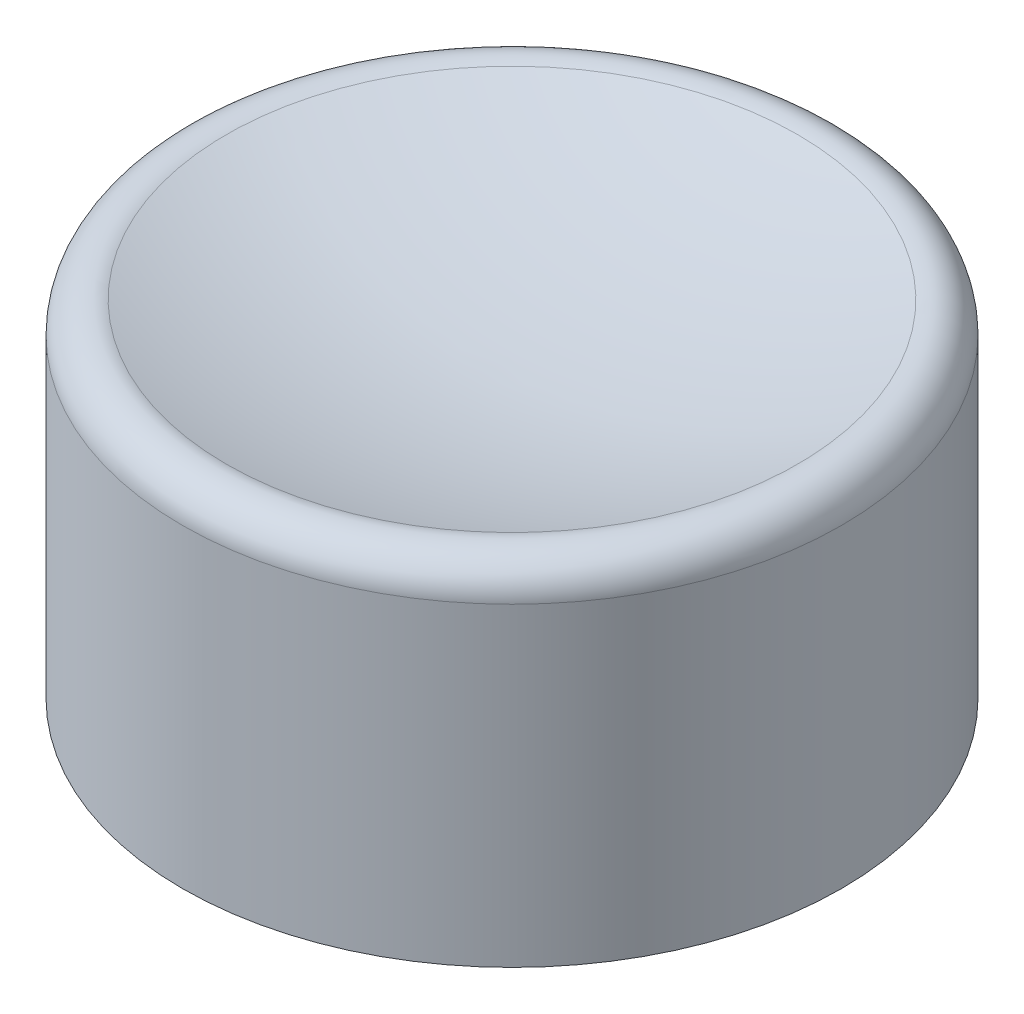
ISO-10303-21;
HEADER;
FILE_DESCRIPTION(('STEP AP214'),'2;1');
FILE_NAME('part.step','',(''),(''),'','','');
FILE_SCHEMA(('AUTOMOTIVE_DESIGN { 1 0 10303 214 1 1 1 1 }'));
ENDSEC;
DATA;
#1=APPLICATION_CONTEXT('core data for automotive mechanical design processes');
#2=APPLICATION_PROTOCOL_DEFINITION('international standard','automotive_design',2000,#1);
#3=PRODUCT_CONTEXT('',#1,'mechanical');
#4=PRODUCT('Part','Part','',(#3));
#5=PRODUCT_RELATED_PRODUCT_CATEGORY('part','',(#4));
#6=PRODUCT_DEFINITION_FORMATION('','',#4);
#7=PRODUCT_DEFINITION_CONTEXT('part definition',#1,'design');
#8=PRODUCT_DEFINITION('design','',#6,#7);
#9=PRODUCT_DEFINITION_SHAPE('','',#8);
#10=(LENGTH_UNIT() NAMED_UNIT(*) SI_UNIT(.MILLI.,.METRE.));
#11=(NAMED_UNIT(*) PLANE_ANGLE_UNIT() SI_UNIT($,.RADIAN.));
#12=(NAMED_UNIT(*) SI_UNIT($,.STERADIAN.) SOLID_ANGLE_UNIT());
#13=UNCERTAINTY_MEASURE_WITH_UNIT(LENGTH_MEASURE(1.E-05),#10,'distance_accuracy_value','');
#14=(GEOMETRIC_REPRESENTATION_CONTEXT(3) GLOBAL_UNCERTAINTY_ASSIGNED_CONTEXT((#13)) GLOBAL_UNIT_ASSIGNED_CONTEXT((#10,
#11,#12)) REPRESENTATION_CONTEXT('',''));
#15=CARTESIAN_POINT('',(0.,0.,0.));
#16=DIRECTION('',(0.,0.,1.));
#17=DIRECTION('',(1.,0.,0.));
#18=AXIS2_PLACEMENT_3D('',#15,#16,#17);
#19=CARTESIAN_POINT('',(0.,5.5,0.));
#20=DIRECTION('',(0.,-1.,0.));
#21=DIRECTION('',(0.,0.,-1.));
#22=AXIS2_PLACEMENT_3D('',#19,#20,#21);
#23=CYLINDRICAL_SURFACE('',#22,5.);
#24=CARTESIAN_POINT('',(0.,4.77207793864214,0.));
#25=DIRECTION('',(0.,1.,0.));
#26=DIRECTION('',(0.,0.,1.));
#27=AXIS2_PLACEMENT_3D('',#24,#25,#26);
#28=CIRCLE('',#27,5.);
#29=CARTESIAN_POINT('',(0.,4.77207793864214,5.));
#30=VERTEX_POINT('',#29);
#31=EDGE_CURVE('E10',#30,#30,#28,.F.);
#32=ORIENTED_EDGE('',*,*,#31,.T.);
#33=EDGE_LOOP('',(#32));
#34=FACE_BOUND('',#33,.T.);
#35=CARTESIAN_POINT('',(0.,0.,0.));
#36=DIRECTION('',(0.,1.,0.));
#37=DIRECTION('',(0.,0.,1.));
#38=AXIS2_PLACEMENT_3D('',#35,#36,#37);
#39=CIRCLE('',#38,5.);
#40=CARTESIAN_POINT('',(0.,0.,5.));
#41=VERTEX_POINT('',#40);
#42=EDGE_CURVE('E42',#41,#41,#39,.T.);
#43=ORIENTED_EDGE('',*,*,#42,.T.);
#44=EDGE_LOOP('',(#43));
#45=FACE_BOUND('',#44,.T.);
#46=ADVANCED_FACE('F31',(#34,#45),#23,.T.);
#47=CARTESIAN_POINT('',(0.,17.5,0.));
#48=DIRECTION('',(0.,0.,1.));
#49=DIRECTION('',(1.,0.,0.));
#50=AXIS2_PLACEMENT_3D('',#47,#48,#49);
#51=SPHERICAL_SURFACE('',#50,13.);
#52=CARTESIAN_POINT('',(0.,17.5,0.));
#53=DIRECTION('',(0.,1.,0.));
#54=DIRECTION('',(0.,0.,1.));
#55=AXIS2_PLACEMENT_3D('',#52,#53,#54);
#56=SPHERICAL_SURFACE('',#55,13.);
#57=CARTESIAN_POINT('',(0.,5.24348245943318,0.));
#58=DIRECTION('',(0.,1.,0.));
#59=DIRECTION('',(0.,0.,1.));
#60=AXIS2_PLACEMENT_3D('',#57,#58,#59);
#61=CIRCLE('',#60,4.33333333333333);
#62=CARTESIAN_POINT('',(0.,5.24348245943318,4.33333333333333));
#63=VERTEX_POINT('',#62);
#64=EDGE_CURVE('E38',#63,#63,#61,.T.);
#65=ORIENTED_EDGE('',*,*,#64,.T.);
#66=EDGE_LOOP('',(#65));
#67=FACE_BOUND('',#66,.T.);
#68=ADVANCED_FACE('F66',(#67),#56,.F.);
#69=CARTESIAN_POINT('',(0.,0.,0.));
#70=DIRECTION('',(0.,1.,0.));
#71=DIRECTION('',(0.,0.,1.));
#72=AXIS2_PLACEMENT_3D('',#69,#70,#71);
#73=PLANE('',#72);
#74=CARTESIAN_POINT('',(0.,0.,0.));
#75=DIRECTION('',(0.,-1.,0.));
#76=DIRECTION('',(0.,0.,-1.));
#77=AXIS2_PLACEMENT_3D('',#74,#75,#76);
#78=CIRCLE('',#77,1.75);
#79=CARTESIAN_POINT('',(0.,0.,-1.75));
#80=VERTEX_POINT('',#79);
#81=EDGE_CURVE('E49',#80,#80,#78,.T.);
#82=ORIENTED_EDGE('',*,*,#81,.F.);
#83=EDGE_LOOP('',(#82));
#84=FACE_BOUND('',#83,.T.);
#85=ORIENTED_EDGE('',*,*,#42,.F.);
#86=EDGE_LOOP('',(#85));
#87=FACE_BOUND('',#86,.T.);
#88=ADVANCED_FACE('F60',(#84,#87),#73,.F.);
#89=CARTESIAN_POINT('',(0.,4.,0.));
#90=DIRECTION('',(0.,-1.,0.));
#91=DIRECTION('',(0.,0.,-1.));
#92=AXIS2_PLACEMENT_3D('',#89,#90,#91);
#93=CYLINDRICAL_SURFACE('',#92,1.75);
#94=CARTESIAN_POINT('',(0.,4.,0.));
#95=DIRECTION('',(0.,-1.,0.));
#96=DIRECTION('',(0.,0.,-1.));
#97=AXIS2_PLACEMENT_3D('',#94,#95,#96);
#98=CIRCLE('',#97,1.75);
#99=CARTESIAN_POINT('',(0.,4.,-1.75));
#100=VERTEX_POINT('',#99);
#101=EDGE_CURVE('E46',#100,#100,#98,.T.);
#102=ORIENTED_EDGE('',*,*,#101,.F.);
#103=EDGE_LOOP('',(#102));
#104=FACE_BOUND('',#103,.T.);
#105=ORIENTED_EDGE('',*,*,#81,.T.);
#106=EDGE_LOOP('',(#105));
#107=FACE_BOUND('',#106,.T.);
#108=ADVANCED_FACE('F57',(#104,#107),#93,.F.);
#109=CARTESIAN_POINT('',(0.,4.,0.));
#110=DIRECTION('',(0.,-1.,0.));
#111=DIRECTION('',(0.,0.,-1.));
#112=AXIS2_PLACEMENT_3D('',#109,#110,#111);
#113=PLANE('',#112);
#114=ORIENTED_EDGE('',*,*,#101,.T.);
#115=EDGE_LOOP('',(#114));
#116=FACE_BOUND('',#115,.T.);
#117=ADVANCED_FACE('F55',(#116),#113,.T.);
#118=CARTESIAN_POINT('',(0.,4.77207793864214,0.));
#119=DIRECTION('',(0.,1.,0.));
#120=DIRECTION('',(0.,0.,1.));
#121=AXIS2_PLACEMENT_3D('',#118,#119,#120);
#122=TOROIDAL_SURFACE('',#121,4.5,0.5);
#123=ORIENTED_EDGE('',*,*,#31,.F.);
#124=EDGE_LOOP('',(#123));
#125=FACE_BOUND('',#124,.T.);
#126=ORIENTED_EDGE('',*,*,#64,.F.);
#127=EDGE_LOOP('',(#126));
#128=FACE_BOUND('',#127,.T.);
#129=ADVANCED_FACE('F33',(#125,#128),#122,.T.);
#130=CLOSED_SHELL('',(#46,#68,#88,#108,#117,#129));
#131=MANIFOLD_SOLID_BREP('B2',#130);
#132=ADVANCED_BREP_SHAPE_REPRESENTATION('',(#18,#131),#14);
#133=SHAPE_DEFINITION_REPRESENTATION(#9,#132);
ENDSEC;
END-ISO-10303-21;
